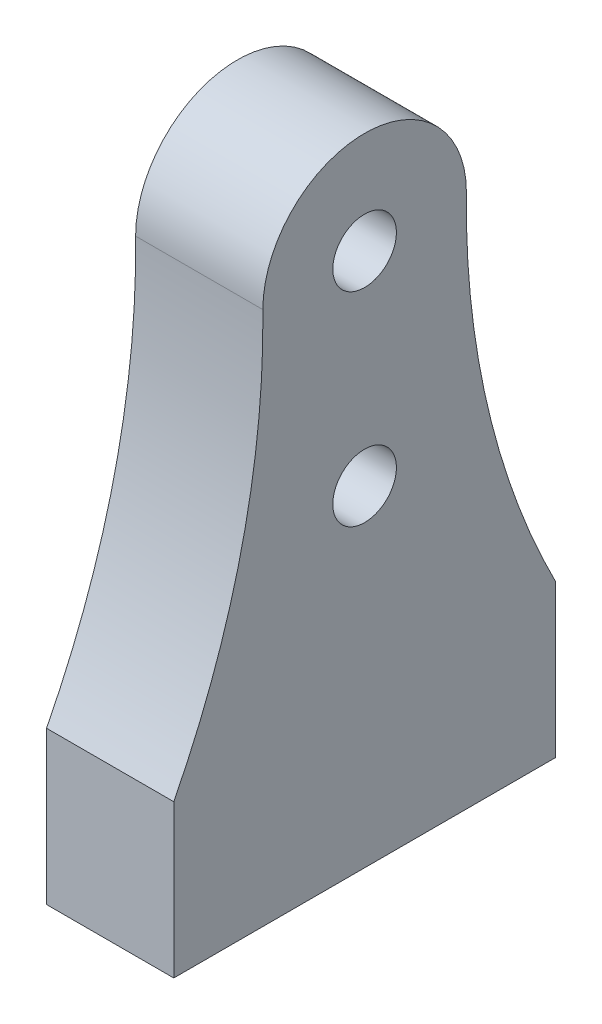
ISO-10303-21;
HEADER;
FILE_DESCRIPTION(('STEP AP214'),'2;1');
FILE_NAME('part.step','',(''),(''),'','','');
FILE_SCHEMA(('AUTOMOTIVE_DESIGN { 1 0 10303 214 1 1 1 1 }'));
ENDSEC;
DATA;
#1=APPLICATION_CONTEXT('core data for automotive mechanical design processes');
#2=APPLICATION_PROTOCOL_DEFINITION('international standard','automotive_design',2000,#1);
#3=PRODUCT_CONTEXT('',#1,'mechanical');
#4=PRODUCT('Part','Part','',(#3));
#5=PRODUCT_RELATED_PRODUCT_CATEGORY('part','',(#4));
#6=PRODUCT_DEFINITION_FORMATION('','',#4);
#7=PRODUCT_DEFINITION_CONTEXT('part definition',#1,'design');
#8=PRODUCT_DEFINITION('design','',#6,#7);
#9=PRODUCT_DEFINITION_SHAPE('','',#8);
#10=(LENGTH_UNIT() NAMED_UNIT(*) SI_UNIT(.MILLI.,.METRE.));
#11=(NAMED_UNIT(*) PLANE_ANGLE_UNIT() SI_UNIT($,.RADIAN.));
#12=(NAMED_UNIT(*) SI_UNIT($,.STERADIAN.) SOLID_ANGLE_UNIT());
#13=UNCERTAINTY_MEASURE_WITH_UNIT(LENGTH_MEASURE(1.E-05),#10,'distance_accuracy_value','');
#14=(GEOMETRIC_REPRESENTATION_CONTEXT(3) GLOBAL_UNCERTAINTY_ASSIGNED_CONTEXT((#13)) GLOBAL_UNIT_ASSIGNED_CONTEXT((#10,
#11,#12)) REPRESENTATION_CONTEXT('',''));
#15=CARTESIAN_POINT('',(0.,0.,0.));
#16=DIRECTION('',(0.,0.,1.));
#17=DIRECTION('',(1.,0.,0.));
#18=AXIS2_PLACEMENT_3D('',#15,#16,#17);
#19=CARTESIAN_POINT('',(2.5,-12.5,-7.5));
#20=DIRECTION('',(0.,0.,1.));
#21=DIRECTION('',(0.,-1.,0.));
#22=AXIS2_PLACEMENT_3D('',#19,#20,#21);
#23=PLANE('',#22);
#24=DIRECTION('',(0.,1.,0.));
#25=VECTOR('',#24,1.);
#26=CARTESIAN_POINT('',(-2.5,-12.5,-7.5));
#27=LINE('',#26,#25);
#28=CARTESIAN_POINT('',(-2.5,-12.5,-7.5));
#29=VERTEX_POINT('',#28);
#30=CARTESIAN_POINT('',(-2.5,-6.5,-7.49999999999999));
#31=VERTEX_POINT('',#30);
#32=EDGE_CURVE('E134',#29,#31,#27,.T.);
#33=ORIENTED_EDGE('',*,*,#32,.T.);
#34=DIRECTION('',(-1.,0.,0.));
#35=VECTOR('',#34,1.);
#36=CARTESIAN_POINT('',(2.5,-6.5,-7.49999999999999));
#37=LINE('',#36,#35);
#38=CARTESIAN_POINT('',(2.5,-6.5,-7.49999999999999));
#39=VERTEX_POINT('',#38);
#40=EDGE_CURVE('E11',#39,#31,#37,.T.);
#41=ORIENTED_EDGE('',*,*,#40,.F.);
#42=DIRECTION('',(0.,1.,0.));
#43=VECTOR('',#42,1.);
#44=CARTESIAN_POINT('',(2.5,-12.5,-7.5));
#45=LINE('',#44,#43);
#46=CARTESIAN_POINT('',(2.5,-12.5,-7.5));
#47=VERTEX_POINT('',#46);
#48=EDGE_CURVE('E145',#47,#39,#45,.T.);
#49=ORIENTED_EDGE('',*,*,#48,.F.);
#50=DIRECTION('',(-1.,0.,0.));
#51=VECTOR('',#50,1.);
#52=CARTESIAN_POINT('',(2.5,-12.5,-7.5));
#53=LINE('',#52,#51);
#54=EDGE_CURVE('E130',#47,#29,#53,.T.);
#55=ORIENTED_EDGE('',*,*,#54,.T.);
#56=EDGE_LOOP('',(#33,#41,#49,#55));
#57=FACE_BOUND('',#56,.T.);
#58=ADVANCED_FACE('F47',(#57),#23,.F.);
#59=CARTESIAN_POINT('',(2.5,8.0576198088058,-35.9969420377391));
#60=DIRECTION('',(-1.,0.,0.));
#61=DIRECTION('',(0.,0.,1.));
#62=AXIS2_PLACEMENT_3D('',#59,#60,#61);
#63=CYLINDRICAL_SURFACE('',#62,32.);
#64=CARTESIAN_POINT('',(-2.5,8.0576198088058,-35.9969420377391));
#65=DIRECTION('',(-1.,0.,0.));
#66=DIRECTION('',(0.,0.,-1.));
#67=AXIS2_PLACEMENT_3D('',#64,#65,#66);
#68=CIRCLE('',#67,32.);
#69=CARTESIAN_POINT('',(-2.5,8.5,-3.99999999999999));
#70=VERTEX_POINT('',#69);
#71=EDGE_CURVE('E137',#31,#70,#68,.T.);
#72=ORIENTED_EDGE('',*,*,#71,.T.);
#73=DIRECTION('',(-1.,0.,0.));
#74=VECTOR('',#73,1.);
#75=CARTESIAN_POINT('',(2.5,8.5,-3.99999999999999));
#76=LINE('',#75,#74);
#77=CARTESIAN_POINT('',(2.5,8.5,-3.99999999999999));
#78=VERTEX_POINT('',#77);
#79=EDGE_CURVE('E55',#78,#70,#76,.T.);
#80=ORIENTED_EDGE('',*,*,#79,.F.);
#81=CARTESIAN_POINT('',(2.5,8.0576198088058,-35.9969420377391));
#82=DIRECTION('',(-1.,0.,0.));
#83=DIRECTION('',(0.,0.,-1.));
#84=AXIS2_PLACEMENT_3D('',#81,#82,#83);
#85=CIRCLE('',#84,32.);
#86=EDGE_CURVE('E101',#39,#78,#85,.T.);
#87=ORIENTED_EDGE('',*,*,#86,.F.);
#88=ORIENTED_EDGE('',*,*,#40,.T.);
#89=EDGE_LOOP('',(#72,#80,#87,#88));
#90=FACE_BOUND('',#89,.T.);
#91=ADVANCED_FACE('F173',(#90),#63,.F.);
#92=CARTESIAN_POINT('',(2.5,8.5,0.));
#93=DIRECTION('',(-1.,0.,0.));
#94=DIRECTION('',(0.,0.,1.));
#95=AXIS2_PLACEMENT_3D('',#92,#93,#94);
#96=CYLINDRICAL_SURFACE('',#95,4.);
#97=CARTESIAN_POINT('',(-2.5,8.5,0.));
#98=DIRECTION('',(1.,0.,0.));
#99=DIRECTION('',(0.,0.,1.));
#100=AXIS2_PLACEMENT_3D('',#97,#98,#99);
#101=CIRCLE('',#100,4.);
#102=CARTESIAN_POINT('',(-2.5,8.50000000000001,4.));
#103=VERTEX_POINT('',#102);
#104=EDGE_CURVE('E140',#70,#103,#101,.T.);
#105=ORIENTED_EDGE('',*,*,#104,.T.);
#106=DIRECTION('',(-1.,0.,0.));
#107=VECTOR('',#106,1.);
#108=CARTESIAN_POINT('',(2.5,8.50000000000001,4.));
#109=LINE('',#108,#107);
#110=CARTESIAN_POINT('',(2.5,8.50000000000001,4.));
#111=VERTEX_POINT('',#110);
#112=EDGE_CURVE('E125',#111,#103,#109,.T.);
#113=ORIENTED_EDGE('',*,*,#112,.F.);
#114=CARTESIAN_POINT('',(2.5,8.5,0.));
#115=DIRECTION('',(1.,0.,0.));
#116=DIRECTION('',(0.,0.,1.));
#117=AXIS2_PLACEMENT_3D('',#114,#115,#116);
#118=CIRCLE('',#117,4.);
#119=EDGE_CURVE('E116',#78,#111,#118,.T.);
#120=ORIENTED_EDGE('',*,*,#119,.F.);
#121=ORIENTED_EDGE('',*,*,#79,.T.);
#122=EDGE_LOOP('',(#105,#113,#120,#121));
#123=FACE_BOUND('',#122,.T.);
#124=ADVANCED_FACE('F151',(#123),#96,.T.);
#125=CARTESIAN_POINT('',(2.5,8.05761980880579,35.9969420377392));
#126=DIRECTION('',(-1.,0.,0.));
#127=DIRECTION('',(0.,0.,1.));
#128=AXIS2_PLACEMENT_3D('',#125,#126,#127);
#129=CYLINDRICAL_SURFACE('',#128,32.);
#130=CARTESIAN_POINT('',(-2.5,8.05761980880579,35.9969420377392));
#131=DIRECTION('',(-1.,0.,0.));
#132=DIRECTION('',(0.,0.,-1.));
#133=AXIS2_PLACEMENT_3D('',#130,#131,#132);
#134=CIRCLE('',#133,32.);
#135=CARTESIAN_POINT('',(-2.5,-6.5,7.5));
#136=VERTEX_POINT('',#135);
#137=EDGE_CURVE('E124',#103,#136,#134,.T.);
#138=ORIENTED_EDGE('',*,*,#137,.T.);
#139=DIRECTION('',(-1.,0.,0.));
#140=VECTOR('',#139,1.);
#141=CARTESIAN_POINT('',(2.5,-6.5,7.5));
#142=LINE('',#141,#140);
#143=CARTESIAN_POINT('',(2.5,-6.5,7.5));
#144=VERTEX_POINT('',#143);
#145=EDGE_CURVE('E121',#144,#136,#142,.T.);
#146=ORIENTED_EDGE('',*,*,#145,.F.);
#147=CARTESIAN_POINT('',(2.5,8.05761980880579,35.9969420377392));
#148=DIRECTION('',(-1.,0.,0.));
#149=DIRECTION('',(0.,0.,-1.));
#150=AXIS2_PLACEMENT_3D('',#147,#148,#149);
#151=CIRCLE('',#150,32.);
#152=EDGE_CURVE('E110',#111,#144,#151,.T.);
#153=ORIENTED_EDGE('',*,*,#152,.F.);
#154=ORIENTED_EDGE('',*,*,#112,.T.);
#155=EDGE_LOOP('',(#138,#146,#153,#154));
#156=FACE_BOUND('',#155,.T.);
#157=ADVANCED_FACE('F122',(#156),#129,.F.);
#158=CARTESIAN_POINT('',(2.5,-6.5,7.5));
#159=DIRECTION('',(0.,0.,-1.));
#160=DIRECTION('',(-1.,0.,0.));
#161=AXIS2_PLACEMENT_3D('',#158,#159,#160);
#162=PLANE('',#161);
#163=DIRECTION('',(0.,-1.,0.));
#164=VECTOR('',#163,1.);
#165=CARTESIAN_POINT('',(-2.5,-6.5,7.5));
#166=LINE('',#165,#164);
#167=CARTESIAN_POINT('',(-2.5,-12.5,7.5));
#168=VERTEX_POINT('',#167);
#169=EDGE_CURVE('E87',#136,#168,#166,.T.);
#170=ORIENTED_EDGE('',*,*,#169,.T.);
#171=DIRECTION('',(-1.,0.,0.));
#172=VECTOR('',#171,1.);
#173=CARTESIAN_POINT('',(2.5,-12.5,7.5));
#174=LINE('',#173,#172);
#175=CARTESIAN_POINT('',(2.5,-12.5,7.5));
#176=VERTEX_POINT('',#175);
#177=EDGE_CURVE('E126',#176,#168,#174,.T.);
#178=ORIENTED_EDGE('',*,*,#177,.F.);
#179=DIRECTION('',(0.,-1.,0.));
#180=VECTOR('',#179,1.);
#181=CARTESIAN_POINT('',(2.5,-6.5,7.5));
#182=LINE('',#181,#180);
#183=EDGE_CURVE('E114',#144,#176,#182,.T.);
#184=ORIENTED_EDGE('',*,*,#183,.F.);
#185=ORIENTED_EDGE('',*,*,#145,.T.);
#186=EDGE_LOOP('',(#170,#178,#184,#185));
#187=FACE_BOUND('',#186,.T.);
#188=ADVANCED_FACE('F128',(#187),#162,.F.);
#189=CARTESIAN_POINT('',(2.5,-12.5,7.5));
#190=DIRECTION('',(0.,1.,0.));
#191=DIRECTION('',(0.,0.,1.));
#192=AXIS2_PLACEMENT_3D('',#189,#190,#191);
#193=PLANE('',#192);
#194=CARTESIAN_POINT('',(0.,-12.5,3.25));
#195=DIRECTION('',(0.,-1.,0.));
#196=DIRECTION('',(0.,0.,-1.));
#197=AXIS2_PLACEMENT_3D('',#194,#195,#196);
#198=CIRCLE('',#197,1.25);
#199=CARTESIAN_POINT('',(0.,-12.5,2.));
#200=VERTEX_POINT('',#199);
#201=EDGE_CURVE('E347',#200,#200,#198,.T.);
#202=ORIENTED_EDGE('',*,*,#201,.F.);
#203=EDGE_LOOP('',(#202));
#204=FACE_BOUND('',#203,.T.);
#205=CARTESIAN_POINT('',(0.,-12.5,-3.25));
#206=DIRECTION('',(0.,-1.,0.));
#207=DIRECTION('',(0.,0.,-1.));
#208=AXIS2_PLACEMENT_3D('',#205,#206,#207);
#209=CIRCLE('',#208,1.25);
#210=CARTESIAN_POINT('',(0.,-12.5,-4.5));
#211=VERTEX_POINT('',#210);
#212=EDGE_CURVE('E349',#211,#211,#209,.T.);
#213=ORIENTED_EDGE('',*,*,#212,.F.);
#214=EDGE_LOOP('',(#213));
#215=FACE_BOUND('',#214,.T.);
#216=DIRECTION('',(0.,0.,-1.));
#217=VECTOR('',#216,1.);
#218=CARTESIAN_POINT('',(-2.5,-12.5,7.5));
#219=LINE('',#218,#217);
#220=EDGE_CURVE('E93',#168,#29,#219,.T.);
#221=ORIENTED_EDGE('',*,*,#220,.T.);
#222=ORIENTED_EDGE('',*,*,#54,.F.);
#223=DIRECTION('',(0.,0.,-1.));
#224=VECTOR('',#223,1.);
#225=CARTESIAN_POINT('',(2.5,-12.5,7.5));
#226=LINE('',#225,#224);
#227=EDGE_CURVE('E63',#176,#47,#226,.T.);
#228=ORIENTED_EDGE('',*,*,#227,.F.);
#229=ORIENTED_EDGE('',*,*,#177,.T.);
#230=EDGE_LOOP('',(#221,#222,#228,#229));
#231=FACE_BOUND('',#230,.T.);
#232=ADVANCED_FACE('F158',(#204,#215,#231),#193,.F.);
#233=CARTESIAN_POINT('',(2.5,8.0576198088058,-35.9969420377391));
#234=DIRECTION('',(1.,0.,0.));
#235=DIRECTION('',(0.,0.,-1.));
#236=AXIS2_PLACEMENT_3D('',#233,#234,#235);
#237=PLANE('',#236);
#238=CARTESIAN_POINT('',(2.5,8.5,0.));
#239=DIRECTION('',(1.,0.,0.));
#240=DIRECTION('',(0.,0.,-1.));
#241=AXIS2_PLACEMENT_3D('',#238,#239,#240);
#242=CIRCLE('',#241,1.24999999999999);
#243=CARTESIAN_POINT('',(2.5,8.5,-1.24999999999999));
#244=VERTEX_POINT('',#243);
#245=EDGE_CURVE('E357',#244,#244,#242,.T.);
#246=ORIENTED_EDGE('',*,*,#245,.F.);
#247=EDGE_LOOP('',(#246));
#248=FACE_BOUND('',#247,.T.);
#249=CARTESIAN_POINT('',(2.5,0.499999999999997,0.));
#250=DIRECTION('',(1.,0.,0.));
#251=DIRECTION('',(0.,0.,-1.));
#252=AXIS2_PLACEMENT_3D('',#249,#250,#251);
#253=CIRCLE('',#252,1.24999999999999);
#254=CARTESIAN_POINT('',(2.5,0.499999999999997,-1.24999999999999));
#255=VERTEX_POINT('',#254);
#256=EDGE_CURVE('E363',#255,#255,#253,.T.);
#257=ORIENTED_EDGE('',*,*,#256,.F.);
#258=EDGE_LOOP('',(#257));
#259=FACE_BOUND('',#258,.T.);
#260=ORIENTED_EDGE('',*,*,#48,.T.);
#261=ORIENTED_EDGE('',*,*,#86,.T.);
#262=ORIENTED_EDGE('',*,*,#119,.T.);
#263=ORIENTED_EDGE('',*,*,#152,.T.);
#264=ORIENTED_EDGE('',*,*,#183,.T.);
#265=ORIENTED_EDGE('',*,*,#227,.T.);
#266=EDGE_LOOP('',(#260,#261,#262,#263,#264,#265));
#267=FACE_BOUND('',#266,.T.);
#268=ADVANCED_FACE('F112',(#248,#259,#267),#237,.T.);
#269=CARTESIAN_POINT('',(-2.5,8.0576198088058,-35.9969420377391));
#270=DIRECTION('',(1.,0.,0.));
#271=DIRECTION('',(0.,0.,-1.));
#272=AXIS2_PLACEMENT_3D('',#269,#270,#271);
#273=PLANE('',#272);
#274=CARTESIAN_POINT('',(-2.5,8.5,0.));
#275=DIRECTION('',(1.,0.,0.));
#276=DIRECTION('',(0.,0.,-1.));
#277=AXIS2_PLACEMENT_3D('',#274,#275,#276);
#278=CIRCLE('',#277,1.24999999999999);
#279=CARTESIAN_POINT('',(-2.5,8.5,-1.24999999999999));
#280=VERTEX_POINT('',#279);
#281=EDGE_CURVE('E360',#280,#280,#278,.T.);
#282=ORIENTED_EDGE('',*,*,#281,.T.);
#283=EDGE_LOOP('',(#282));
#284=FACE_BOUND('',#283,.T.);
#285=CARTESIAN_POINT('',(-2.5,0.499999999999997,0.));
#286=DIRECTION('',(1.,0.,0.));
#287=DIRECTION('',(0.,0.,-1.));
#288=AXIS2_PLACEMENT_3D('',#285,#286,#287);
#289=CIRCLE('',#288,1.24999999999999);
#290=CARTESIAN_POINT('',(-2.5,0.499999999999997,-1.24999999999999));
#291=VERTEX_POINT('',#290);
#292=EDGE_CURVE('E138',#291,#291,#289,.T.);
#293=ORIENTED_EDGE('',*,*,#292,.T.);
#294=EDGE_LOOP('',(#293));
#295=FACE_BOUND('',#294,.T.);
#296=ORIENTED_EDGE('',*,*,#32,.F.);
#297=ORIENTED_EDGE('',*,*,#220,.F.);
#298=ORIENTED_EDGE('',*,*,#169,.F.);
#299=ORIENTED_EDGE('',*,*,#137,.F.);
#300=ORIENTED_EDGE('',*,*,#104,.F.);
#301=ORIENTED_EDGE('',*,*,#71,.F.);
#302=EDGE_LOOP('',(#296,#297,#298,#299,#300,#301));
#303=FACE_BOUND('',#302,.T.);
#304=ADVANCED_FACE('F154',(#284,#295,#303),#273,.F.);
#305=CARTESIAN_POINT('',(2.5,0.499999999999997,0.));
#306=DIRECTION('',(1.,0.,0.));
#307=DIRECTION('',(0.,0.,-1.));
#308=AXIS2_PLACEMENT_3D('',#305,#306,#307);
#309=CYLINDRICAL_SURFACE('',#308,1.24999999999999);
#310=ORIENTED_EDGE('',*,*,#292,.F.);
#311=EDGE_LOOP('',(#310));
#312=FACE_BOUND('',#311,.T.);
#313=ORIENTED_EDGE('',*,*,#256,.T.);
#314=EDGE_LOOP('',(#313));
#315=FACE_BOUND('',#314,.T.);
#316=ADVANCED_FACE('F213',(#312,#315),#309,.F.);
#317=CARTESIAN_POINT('',(2.5,8.5,0.));
#318=DIRECTION('',(1.,0.,0.));
#319=DIRECTION('',(0.,0.,-1.));
#320=AXIS2_PLACEMENT_3D('',#317,#318,#319);
#321=CYLINDRICAL_SURFACE('',#320,1.24999999999999);
#322=ORIENTED_EDGE('',*,*,#281,.F.);
#323=EDGE_LOOP('',(#322));
#324=FACE_BOUND('',#323,.T.);
#325=ORIENTED_EDGE('',*,*,#245,.T.);
#326=EDGE_LOOP('',(#325));
#327=FACE_BOUND('',#326,.T.);
#328=ADVANCED_FACE('F223',(#324,#327),#321,.F.);
#329=CARTESIAN_POINT('',(0.,-7.5,-3.25));
#330=DIRECTION('',(0.,-1.,0.));
#331=DIRECTION('',(0.,0.,-1.));
#332=AXIS2_PLACEMENT_3D('',#329,#330,#331);
#333=CONICAL_SURFACE('',#332,1.25,1.02974425867665);
#334=CARTESIAN_POINT('',(0.,-6.74892422621555,-3.25));
#335=VERTEX_POINT('',#334);
#336=VERTEX_LOOP('',#335);
#337=FACE_BOUND('',#336,.T.);
#338=CARTESIAN_POINT('',(0.,-7.5,-3.25));
#339=DIRECTION('',(0.,-1.,0.));
#340=DIRECTION('',(0.,0.,-1.));
#341=AXIS2_PLACEMENT_3D('',#338,#339,#340);
#342=CIRCLE('',#341,1.25);
#343=CARTESIAN_POINT('',(0.,-7.5,-4.5));
#344=VERTEX_POINT('',#343);
#345=EDGE_CURVE('E354',#344,#344,#342,.T.);
#346=ORIENTED_EDGE('',*,*,#345,.T.);
#347=EDGE_LOOP('',(#346));
#348=FACE_BOUND('',#347,.T.);
#349=ADVANCED_FACE('F235',(#337,#348),#333,.F.);
#350=CARTESIAN_POINT('',(0.,-12.5,-3.25));
#351=DIRECTION('',(0.,-1.,0.));
#352=DIRECTION('',(0.,0.,-1.));
#353=AXIS2_PLACEMENT_3D('',#350,#351,#352);
#354=CYLINDRICAL_SURFACE('',#353,1.25);
#355=ORIENTED_EDGE('',*,*,#345,.F.);
#356=EDGE_LOOP('',(#355));
#357=FACE_BOUND('',#356,.T.);
#358=ORIENTED_EDGE('',*,*,#212,.T.);
#359=EDGE_LOOP('',(#358));
#360=FACE_BOUND('',#359,.T.);
#361=ADVANCED_FACE('F256',(#357,#360),#354,.F.);
#362=CARTESIAN_POINT('',(0.,-7.5,3.25));
#363=DIRECTION('',(0.,-1.,0.));
#364=DIRECTION('',(0.,0.,-1.));
#365=AXIS2_PLACEMENT_3D('',#362,#363,#364);
#366=CONICAL_SURFACE('',#365,1.25,1.02974425867665);
#367=CARTESIAN_POINT('',(0.,-6.74892422621555,3.25));
#368=VERTEX_POINT('',#367);
#369=VERTEX_LOOP('',#368);
#370=FACE_BOUND('',#369,.T.);
#371=CARTESIAN_POINT('',(0.,-7.5,3.25));
#372=DIRECTION('',(0.,-1.,0.));
#373=DIRECTION('',(0.,0.,-1.));
#374=AXIS2_PLACEMENT_3D('',#371,#372,#373);
#375=CIRCLE('',#374,1.25);
#376=CARTESIAN_POINT('',(0.,-7.5,2.));
#377=VERTEX_POINT('',#376);
#378=EDGE_CURVE('E345',#377,#377,#375,.T.);
#379=ORIENTED_EDGE('',*,*,#378,.T.);
#380=EDGE_LOOP('',(#379));
#381=FACE_BOUND('',#380,.T.);
#382=ADVANCED_FACE('F267',(#370,#381),#366,.F.);
#383=CARTESIAN_POINT('',(0.,-12.5,3.25));
#384=DIRECTION('',(0.,-1.,0.));
#385=DIRECTION('',(0.,0.,-1.));
#386=AXIS2_PLACEMENT_3D('',#383,#384,#385);
#387=CYLINDRICAL_SURFACE('',#386,1.25);
#388=ORIENTED_EDGE('',*,*,#378,.F.);
#389=EDGE_LOOP('',(#388));
#390=FACE_BOUND('',#389,.T.);
#391=ORIENTED_EDGE('',*,*,#201,.T.);
#392=EDGE_LOOP('',(#391));
#393=FACE_BOUND('',#392,.T.);
#394=ADVANCED_FACE('F279',(#390,#393),#387,.F.);
#395=CLOSED_SHELL('',(#58,#91,#124,#157,#188,#232,#268,#304,#316,#328,#349,#361,#382,#394));
#396=MANIFOLD_SOLID_BREP('B2',#395);
#397=ADVANCED_BREP_SHAPE_REPRESENTATION('',(#18,#396),#14);
#398=SHAPE_DEFINITION_REPRESENTATION(#9,#397);
ENDSEC;
END-ISO-10303-21;
